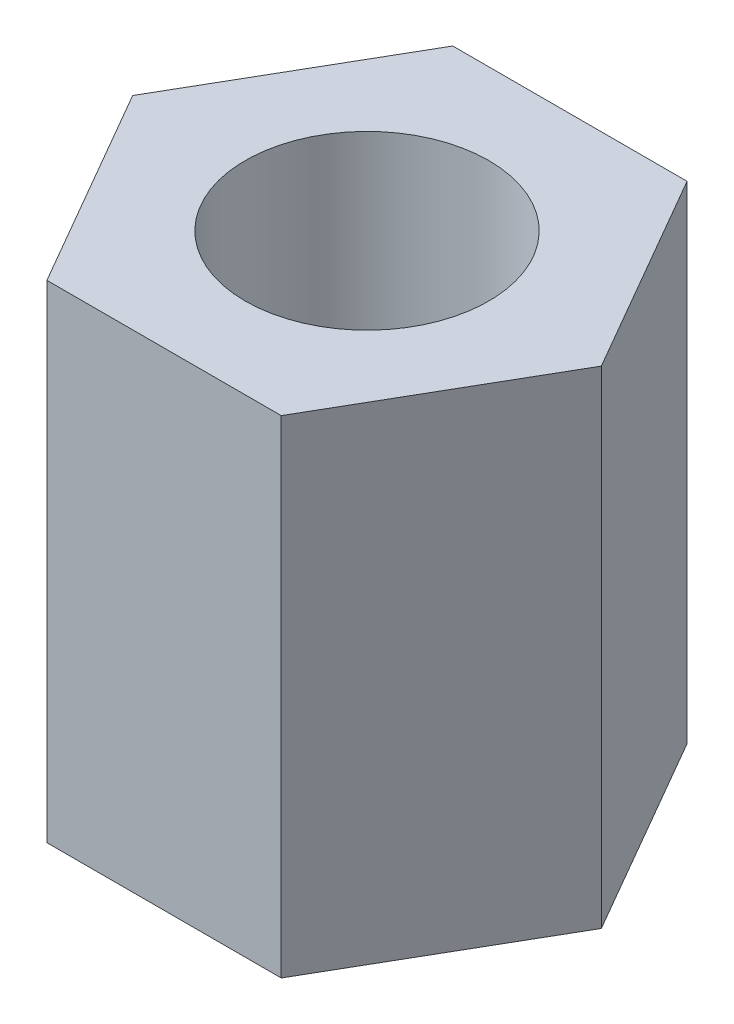
ISO-10303-21;
HEADER;
FILE_DESCRIPTION(('STEP AP214'),'2;1');
FILE_NAME('part.step','',(''),(''),'','','');
FILE_SCHEMA(('AUTOMOTIVE_DESIGN { 1 0 10303 214 1 1 1 1 }'));
ENDSEC;
DATA;
#1=APPLICATION_CONTEXT('core data for automotive mechanical design processes');
#2=APPLICATION_PROTOCOL_DEFINITION('international standard','automotive_design',2000,#1);
#3=PRODUCT_CONTEXT('',#1,'mechanical');
#4=PRODUCT('Part','Part','',(#3));
#5=PRODUCT_RELATED_PRODUCT_CATEGORY('part','',(#4));
#6=PRODUCT_DEFINITION_FORMATION('','',#4);
#7=PRODUCT_DEFINITION_CONTEXT('part definition',#1,'design');
#8=PRODUCT_DEFINITION('design','',#6,#7);
#9=PRODUCT_DEFINITION_SHAPE('','',#8);
#10=(LENGTH_UNIT() NAMED_UNIT(*) SI_UNIT(.MILLI.,.METRE.));
#11=(NAMED_UNIT(*) PLANE_ANGLE_UNIT() SI_UNIT($,.RADIAN.));
#12=(NAMED_UNIT(*) SI_UNIT($,.STERADIAN.) SOLID_ANGLE_UNIT());
#13=UNCERTAINTY_MEASURE_WITH_UNIT(LENGTH_MEASURE(1.E-05),#10,'distance_accuracy_value','');
#14=(GEOMETRIC_REPRESENTATION_CONTEXT(3) GLOBAL_UNCERTAINTY_ASSIGNED_CONTEXT((#13)) GLOBAL_UNIT_ASSIGNED_CONTEXT((#10,
#11,#12)) REPRESENTATION_CONTEXT('',''));
#15=CARTESIAN_POINT('',(0.,0.,0.));
#16=DIRECTION('',(0.,0.,1.));
#17=DIRECTION('',(1.,0.,0.));
#18=AXIS2_PLACEMENT_3D('',#15,#16,#17);
#19=CARTESIAN_POINT('',(-1.44337567297405,6.,2.5));
#20=DIRECTION('',(0.,0.,-1.));
#21=DIRECTION('',(-1.,0.,0.));
#22=AXIS2_PLACEMENT_3D('',#19,#20,#21);
#23=PLANE('',#22);
#24=DIRECTION('',(1.,0.,0.));
#25=VECTOR('',#24,1.);
#26=CARTESIAN_POINT('',(-1.44337567297405,0.,2.5));
#27=LINE('',#26,#25);
#28=CARTESIAN_POINT('',(-1.44337567297405,0.,2.5));
#29=VERTEX_POINT('',#28);
#30=CARTESIAN_POINT('',(1.44337567297408,0.,2.5));
#31=VERTEX_POINT('',#30);
#32=EDGE_CURVE('E89',#29,#31,#27,.T.);
#33=ORIENTED_EDGE('',*,*,#32,.F.);
#34=DIRECTION('',(0.,-1.,0.));
#35=VECTOR('',#34,1.);
#36=CARTESIAN_POINT('',(-1.44337567297405,6.,2.5));
#37=LINE('',#36,#35);
#38=CARTESIAN_POINT('',(-1.44337567297405,-6.,2.5));
#39=VERTEX_POINT('',#38);
#40=EDGE_CURVE('E59',#29,#39,#37,.T.);
#41=ORIENTED_EDGE('',*,*,#40,.T.);
#42=DIRECTION('',(1.,0.,0.));
#43=VECTOR('',#42,1.);
#44=CARTESIAN_POINT('',(-1.44337567297405,-6.,2.5));
#45=LINE('',#44,#43);
#46=CARTESIAN_POINT('',(1.44337567297408,-6.,2.5));
#47=VERTEX_POINT('',#46);
#48=EDGE_CURVE('E128',#39,#47,#45,.T.);
#49=ORIENTED_EDGE('',*,*,#48,.T.);
#50=DIRECTION('',(0.,-1.,0.));
#51=VECTOR('',#50,1.);
#52=CARTESIAN_POINT('',(1.44337567297408,6.,2.5));
#53=LINE('',#52,#51);
#54=EDGE_CURVE('E11',#31,#47,#53,.T.);
#55=ORIENTED_EDGE('',*,*,#54,.F.);
#56=EDGE_LOOP('',(#33,#41,#49,#55));
#57=FACE_BOUND('',#56,.T.);
#58=ADVANCED_FACE('F37',(#57),#23,.F.);
#59=CARTESIAN_POINT('',(1.44337567297408,6.,2.5));
#60=DIRECTION('',(-0.866025403784438,0.,-0.500000000000001));
#61=DIRECTION('',(-0.500000000000001,0.,0.866025403784438));
#62=AXIS2_PLACEMENT_3D('',#59,#60,#61);
#63=PLANE('',#62);
#64=DIRECTION('',(0.500000000000001,0.,-0.866025403784438));
#65=VECTOR('',#64,1.);
#66=CARTESIAN_POINT('',(1.44337567297408,0.,2.5));
#67=LINE('',#66,#65);
#68=CARTESIAN_POINT('',(2.88675134594815,0.,0.));
#69=VERTEX_POINT('',#68);
#70=EDGE_CURVE('E96',#31,#69,#67,.T.);
#71=ORIENTED_EDGE('',*,*,#70,.F.);
#72=ORIENTED_EDGE('',*,*,#54,.T.);
#73=DIRECTION('',(0.500000000000001,0.,-0.866025403784438));
#74=VECTOR('',#73,1.);
#75=CARTESIAN_POINT('',(1.44337567297408,-6.,2.5));
#76=LINE('',#75,#74);
#77=CARTESIAN_POINT('',(2.88675134594815,-6.,0.));
#78=VERTEX_POINT('',#77);
#79=EDGE_CURVE('E125',#47,#78,#76,.T.);
#80=ORIENTED_EDGE('',*,*,#79,.T.);
#81=DIRECTION('',(0.,-1.,0.));
#82=VECTOR('',#81,1.);
#83=CARTESIAN_POINT('',(2.88675134594815,6.,0.));
#84=LINE('',#83,#82);
#85=EDGE_CURVE('E44',#69,#78,#84,.T.);
#86=ORIENTED_EDGE('',*,*,#85,.F.);
#87=EDGE_LOOP('',(#71,#72,#80,#86));
#88=FACE_BOUND('',#87,.T.);
#89=ADVANCED_FACE('F126',(#88),#63,.F.);
#90=CARTESIAN_POINT('',(2.88675134594815,6.,0.));
#91=DIRECTION('',(-0.866025403784438,0.,0.500000000000001));
#92=DIRECTION('',(0.500000000000001,0.,0.866025403784438));
#93=AXIS2_PLACEMENT_3D('',#90,#91,#92);
#94=PLANE('',#93);
#95=DIRECTION('',(-0.500000000000001,0.,-0.866025403784438));
#96=VECTOR('',#95,1.);
#97=CARTESIAN_POINT('',(2.88675134594815,0.,0.));
#98=LINE('',#97,#96);
#99=CARTESIAN_POINT('',(1.44337567297408,0.,-2.50000000000001));
#100=VERTEX_POINT('',#99);
#101=EDGE_CURVE('E122',#69,#100,#98,.T.);
#102=ORIENTED_EDGE('',*,*,#101,.F.);
#103=ORIENTED_EDGE('',*,*,#85,.T.);
#104=DIRECTION('',(-0.500000000000001,0.,-0.866025403784438));
#105=VECTOR('',#104,1.);
#106=CARTESIAN_POINT('',(2.88675134594815,-6.,0.));
#107=LINE('',#106,#105);
#108=CARTESIAN_POINT('',(1.44337567297408,-6.,-2.50000000000001));
#109=VERTEX_POINT('',#108);
#110=EDGE_CURVE('E120',#78,#109,#107,.T.);
#111=ORIENTED_EDGE('',*,*,#110,.T.);
#112=DIRECTION('',(0.,-1.,0.));
#113=VECTOR('',#112,1.);
#114=CARTESIAN_POINT('',(1.44337567297408,6.,-2.50000000000001));
#115=LINE('',#114,#113);
#116=EDGE_CURVE('E111',#100,#109,#115,.T.);
#117=ORIENTED_EDGE('',*,*,#116,.F.);
#118=EDGE_LOOP('',(#102,#103,#111,#117));
#119=FACE_BOUND('',#118,.T.);
#120=ADVANCED_FACE('F117',(#119),#94,.F.);
#121=CARTESIAN_POINT('',(1.44337567297408,6.,-2.50000000000001));
#122=DIRECTION('',(0.,0.,1.));
#123=DIRECTION('',(1.,0.,0.));
#124=AXIS2_PLACEMENT_3D('',#121,#122,#123);
#125=PLANE('',#124);
#126=DIRECTION('',(-1.,0.,0.));
#127=VECTOR('',#126,1.);
#128=CARTESIAN_POINT('',(1.44337567297408,0.,-2.50000000000001));
#129=LINE('',#128,#127);
#130=CARTESIAN_POINT('',(-1.44337567297405,0.,-2.50000000000001));
#131=VERTEX_POINT('',#130);
#132=EDGE_CURVE('E147',#100,#131,#129,.T.);
#133=ORIENTED_EDGE('',*,*,#132,.F.);
#134=ORIENTED_EDGE('',*,*,#116,.T.);
#135=DIRECTION('',(-1.,0.,0.));
#136=VECTOR('',#135,1.);
#137=CARTESIAN_POINT('',(1.44337567297408,-6.,-2.50000000000001));
#138=LINE('',#137,#136);
#139=CARTESIAN_POINT('',(-1.44337567297405,-6.,-2.50000000000001));
#140=VERTEX_POINT('',#139);
#141=EDGE_CURVE('E134',#109,#140,#138,.T.);
#142=ORIENTED_EDGE('',*,*,#141,.T.);
#143=DIRECTION('',(0.,-1.,0.));
#144=VECTOR('',#143,1.);
#145=CARTESIAN_POINT('',(-1.44337567297405,6.,-2.50000000000001));
#146=LINE('',#145,#144);
#147=EDGE_CURVE('E104',#131,#140,#146,.T.);
#148=ORIENTED_EDGE('',*,*,#147,.F.);
#149=EDGE_LOOP('',(#133,#134,#142,#148));
#150=FACE_BOUND('',#149,.T.);
#151=ADVANCED_FACE('F170',(#150),#125,.F.);
#152=CARTESIAN_POINT('',(-1.44337567297405,6.,-2.50000000000001));
#153=DIRECTION('',(0.866025403784439,0.,0.5));
#154=DIRECTION('',(0.5,0.,-0.866025403784439));
#155=AXIS2_PLACEMENT_3D('',#152,#153,#154);
#156=PLANE('',#155);
#157=DIRECTION('',(-0.5,0.,0.866025403784438));
#158=VECTOR('',#157,1.);
#159=CARTESIAN_POINT('',(-1.44337567297405,0.,-2.50000000000001));
#160=LINE('',#159,#158);
#161=CARTESIAN_POINT('',(-2.88675134594812,0.,0.));
#162=VERTEX_POINT('',#161);
#163=EDGE_CURVE('E51',#131,#162,#160,.T.);
#164=ORIENTED_EDGE('',*,*,#163,.F.);
#165=ORIENTED_EDGE('',*,*,#147,.T.);
#166=DIRECTION('',(-0.5,0.,0.866025403784438));
#167=VECTOR('',#166,1.);
#168=CARTESIAN_POINT('',(-1.44337567297405,-6.,-2.50000000000001));
#169=LINE('',#168,#167);
#170=CARTESIAN_POINT('',(-2.88675134594812,-6.,0.));
#171=VERTEX_POINT('',#170);
#172=EDGE_CURVE('E106',#140,#171,#169,.T.);
#173=ORIENTED_EDGE('',*,*,#172,.T.);
#174=DIRECTION('',(0.,-1.,0.));
#175=VECTOR('',#174,1.);
#176=CARTESIAN_POINT('',(-2.88675134594812,6.,0.));
#177=LINE('',#176,#175);
#178=EDGE_CURVE('E102',#162,#171,#177,.T.);
#179=ORIENTED_EDGE('',*,*,#178,.F.);
#180=EDGE_LOOP('',(#164,#165,#173,#179));
#181=FACE_BOUND('',#180,.T.);
#182=ADVANCED_FACE('F140',(#181),#156,.F.);
#183=CARTESIAN_POINT('',(-2.88675134594812,6.,0.));
#184=DIRECTION('',(0.866025403784438,0.,-0.500000000000001));
#185=DIRECTION('',(-0.500000000000001,0.,-0.866025403784438));
#186=AXIS2_PLACEMENT_3D('',#183,#184,#185);
#187=PLANE('',#186);
#188=DIRECTION('',(0.5,0.,0.866025403784438));
#189=VECTOR('',#188,1.);
#190=CARTESIAN_POINT('',(-2.88675134594812,0.,0.));
#191=LINE('',#190,#189);
#192=EDGE_CURVE('E87',#162,#29,#191,.T.);
#193=ORIENTED_EDGE('',*,*,#192,.F.);
#194=ORIENTED_EDGE('',*,*,#178,.T.);
#195=DIRECTION('',(0.5,0.,0.866025403784438));
#196=VECTOR('',#195,1.);
#197=CARTESIAN_POINT('',(-2.88675134594812,-6.,0.));
#198=LINE('',#197,#196);
#199=EDGE_CURVE('E100',#171,#39,#198,.T.);
#200=ORIENTED_EDGE('',*,*,#199,.T.);
#201=ORIENTED_EDGE('',*,*,#40,.F.);
#202=EDGE_LOOP('',(#193,#194,#200,#201));
#203=FACE_BOUND('',#202,.T.);
#204=ADVANCED_FACE('F98',(#203),#187,.F.);
#205=CARTESIAN_POINT('',(0.,6.,0.));
#206=DIRECTION('',(0.,-1.,0.));
#207=DIRECTION('',(0.,0.,-1.));
#208=AXIS2_PLACEMENT_3D('',#205,#206,#207);
#209=CYLINDRICAL_SURFACE('',#208,1.5);
#210=CARTESIAN_POINT('',(0.,-6.,0.));
#211=DIRECTION('',(0.,1.,0.));
#212=DIRECTION('',(0.,0.,1.));
#213=AXIS2_PLACEMENT_3D('',#210,#211,#212);
#214=CIRCLE('',#213,1.5);
#215=CARTESIAN_POINT('',(0.,-6.,1.5));
#216=VERTEX_POINT('',#215);
#217=EDGE_CURVE('E142',#216,#216,#214,.T.);
#218=ORIENTED_EDGE('',*,*,#217,.F.);
#219=EDGE_LOOP('',(#218));
#220=FACE_BOUND('',#219,.T.);
#221=CARTESIAN_POINT('',(0.,0.,0.));
#222=DIRECTION('',(0.,1.,0.));
#223=DIRECTION('',(0.,0.,1.));
#224=AXIS2_PLACEMENT_3D('',#221,#222,#223);
#225=CIRCLE('',#224,1.5);
#226=CARTESIAN_POINT('',(0.,0.,1.5));
#227=VERTEX_POINT('',#226);
#228=EDGE_CURVE('E93',#227,#227,#225,.T.);
#229=ORIENTED_EDGE('',*,*,#228,.T.);
#230=EDGE_LOOP('',(#229));
#231=FACE_BOUND('',#230,.T.);
#232=ADVANCED_FACE('F154',(#220,#231),#209,.F.);
#233=CARTESIAN_POINT('',(0.,-6.,0.));
#234=DIRECTION('',(0.,1.,0.));
#235=DIRECTION('',(0.,0.,1.));
#236=AXIS2_PLACEMENT_3D('',#233,#234,#235);
#237=PLANE('',#236);
#238=ORIENTED_EDGE('',*,*,#48,.F.);
#239=ORIENTED_EDGE('',*,*,#199,.F.);
#240=ORIENTED_EDGE('',*,*,#172,.F.);
#241=ORIENTED_EDGE('',*,*,#141,.F.);
#242=ORIENTED_EDGE('',*,*,#110,.F.);
#243=ORIENTED_EDGE('',*,*,#79,.F.);
#244=EDGE_LOOP('',(#238,#239,#240,#241,#242,#243));
#245=FACE_BOUND('',#244,.T.);
#246=ORIENTED_EDGE('',*,*,#217,.T.);
#247=EDGE_LOOP('',(#246));
#248=FACE_BOUND('',#247,.T.);
#249=ADVANCED_FACE('F130',(#245,#248),#237,.F.);
#250=CARTESIAN_POINT('',(0.,0.,0.));
#251=DIRECTION('',(0.,1.,0.));
#252=DIRECTION('',(0.,0.,1.));
#253=AXIS2_PLACEMENT_3D('',#250,#251,#252);
#254=PLANE('',#253);
#255=ORIENTED_EDGE('',*,*,#228,.F.);
#256=EDGE_LOOP('',(#255));
#257=FACE_BOUND('',#256,.T.);
#258=ORIENTED_EDGE('',*,*,#192,.T.);
#259=ORIENTED_EDGE('',*,*,#32,.T.);
#260=ORIENTED_EDGE('',*,*,#70,.T.);
#261=ORIENTED_EDGE('',*,*,#101,.T.);
#262=ORIENTED_EDGE('',*,*,#132,.T.);
#263=ORIENTED_EDGE('',*,*,#163,.T.);
#264=EDGE_LOOP('',(#258,#259,#260,#261,#262,#263));
#265=FACE_BOUND('',#264,.T.);
#266=ADVANCED_FACE('F88',(#257,#265),#254,.T.);
#267=CLOSED_SHELL('',(#58,#89,#120,#151,#182,#204,#232,#249,#266));
#268=MANIFOLD_SOLID_BREP('B2',#267);
#269=ADVANCED_BREP_SHAPE_REPRESENTATION('',(#18,#268),#14);
#270=SHAPE_DEFINITION_REPRESENTATION(#9,#269);
ENDSEC;
END-ISO-10303-21;
